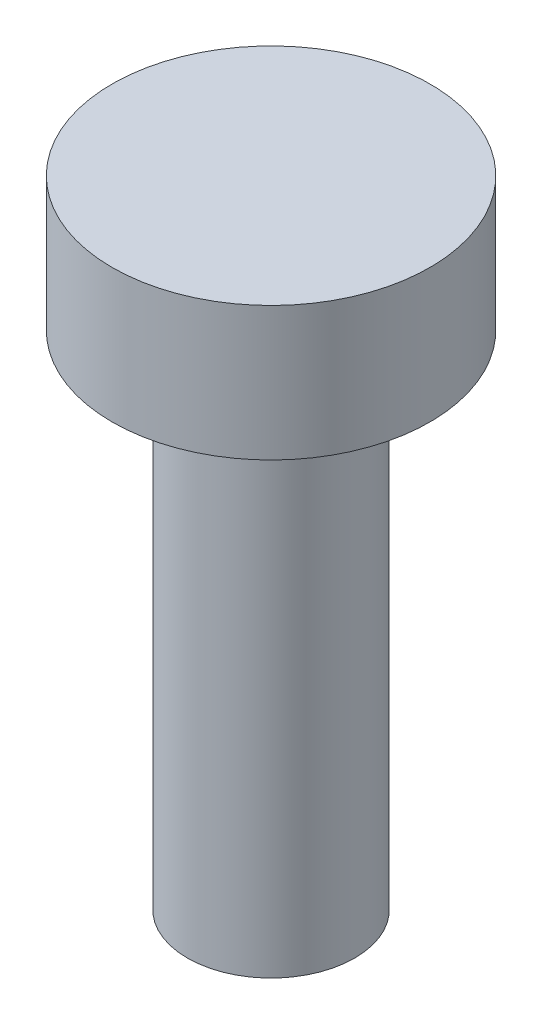
ISO-10303-21;
HEADER;
FILE_DESCRIPTION(('STEP AP214'),'2;1');
FILE_NAME('part.step','',(''),(''),'','','');
FILE_SCHEMA(('AUTOMOTIVE_DESIGN { 1 0 10303 214 1 1 1 1 }'));
ENDSEC;
DATA;
#1=APPLICATION_CONTEXT('core data for automotive mechanical design processes');
#2=APPLICATION_PROTOCOL_DEFINITION('international standard','automotive_design',2000,#1);
#3=PRODUCT_CONTEXT('',#1,'mechanical');
#4=PRODUCT('Part','Part','',(#3));
#5=PRODUCT_RELATED_PRODUCT_CATEGORY('part','',(#4));
#6=PRODUCT_DEFINITION_FORMATION('','',#4);
#7=PRODUCT_DEFINITION_CONTEXT('part definition',#1,'design');
#8=PRODUCT_DEFINITION('design','',#6,#7);
#9=PRODUCT_DEFINITION_SHAPE('','',#8);
#10=(LENGTH_UNIT() NAMED_UNIT(*) SI_UNIT(.MILLI.,.METRE.));
#11=(NAMED_UNIT(*) PLANE_ANGLE_UNIT() SI_UNIT($,.RADIAN.));
#12=(NAMED_UNIT(*) SI_UNIT($,.STERADIAN.) SOLID_ANGLE_UNIT());
#13=UNCERTAINTY_MEASURE_WITH_UNIT(LENGTH_MEASURE(1.E-05),#10,'distance_accuracy_value','');
#14=(GEOMETRIC_REPRESENTATION_CONTEXT(3) GLOBAL_UNCERTAINTY_ASSIGNED_CONTEXT((#13)) GLOBAL_UNIT_ASSIGNED_CONTEXT((#10,
#11,#12)) REPRESENTATION_CONTEXT('',''));
#15=CARTESIAN_POINT('',(0.,0.,0.));
#16=DIRECTION('',(0.,0.,1.));
#17=DIRECTION('',(1.,0.,0.));
#18=AXIS2_PLACEMENT_3D('',#15,#16,#17);
#19=CARTESIAN_POINT('',(0.,1.6,0.));
#20=DIRECTION('',(0.,-1.,0.));
#21=DIRECTION('',(0.,0.,-1.));
#22=AXIS2_PLACEMENT_3D('',#19,#20,#21);
#23=CYLINDRICAL_SURFACE('',#22,1.9);
#24=CARTESIAN_POINT('',(0.,1.6,0.));
#25=DIRECTION('',(0.,1.,0.));
#26=DIRECTION('',(0.,0.,1.));
#27=AXIS2_PLACEMENT_3D('',#24,#25,#26);
#28=CIRCLE('',#27,1.9);
#29=CARTESIAN_POINT('',(0.,1.6,1.9));
#30=VERTEX_POINT('',#29);
#31=EDGE_CURVE('E10',#30,#30,#28,.T.);
#32=ORIENTED_EDGE('',*,*,#31,.F.);
#33=EDGE_LOOP('',(#32));
#34=FACE_BOUND('',#33,.T.);
#35=CARTESIAN_POINT('',(0.,0.,0.));
#36=DIRECTION('',(0.,1.,0.));
#37=DIRECTION('',(0.,0.,1.));
#38=AXIS2_PLACEMENT_3D('',#35,#36,#37);
#39=CIRCLE('',#38,1.9);
#40=CARTESIAN_POINT('',(0.,0.,1.9));
#41=VERTEX_POINT('',#40);
#42=EDGE_CURVE('E42',#41,#41,#39,.T.);
#43=ORIENTED_EDGE('',*,*,#42,.T.);
#44=EDGE_LOOP('',(#43));
#45=FACE_BOUND('',#44,.T.);
#46=ADVANCED_FACE('F41',(#34,#45),#23,.T.);
#47=CARTESIAN_POINT('',(0.,1.6,0.));
#48=DIRECTION('',(0.,1.,0.));
#49=DIRECTION('',(0.,0.,1.));
#50=AXIS2_PLACEMENT_3D('',#47,#48,#49);
#51=PLANE('',#50);
#52=ORIENTED_EDGE('',*,*,#31,.T.);
#53=EDGE_LOOP('',(#52));
#54=FACE_BOUND('',#53,.T.);
#55=ADVANCED_FACE('F74',(#54),#51,.T.);
#56=CARTESIAN_POINT('',(0.,0.,0.));
#57=DIRECTION('',(0.,1.,0.));
#58=DIRECTION('',(0.,0.,1.));
#59=AXIS2_PLACEMENT_3D('',#56,#57,#58);
#60=PLANE('',#59);
#61=CARTESIAN_POINT('',(0.,0.,0.));
#62=DIRECTION('',(0.,1.,0.));
#63=DIRECTION('',(0.,0.,1.));
#64=AXIS2_PLACEMENT_3D('',#61,#62,#63);
#65=CIRCLE('',#64,1.);
#66=CARTESIAN_POINT('',(0.,0.,1.));
#67=VERTEX_POINT('',#66);
#68=EDGE_CURVE('E51',#67,#67,#65,.T.);
#69=ORIENTED_EDGE('',*,*,#68,.T.);
#70=EDGE_LOOP('',(#69));
#71=FACE_BOUND('',#70,.T.);
#72=ORIENTED_EDGE('',*,*,#42,.F.);
#73=EDGE_LOOP('',(#72));
#74=FACE_BOUND('',#73,.T.);
#75=ADVANCED_FACE('F56',(#71,#74),#60,.F.);
#76=CARTESIAN_POINT('',(0.,0.,0.));
#77=DIRECTION('',(0.,-1.,0.));
#78=DIRECTION('',(0.,0.,-1.));
#79=AXIS2_PLACEMENT_3D('',#76,#77,#78);
#80=CYLINDRICAL_SURFACE('',#79,1.);
#81=ORIENTED_EDGE('',*,*,#68,.F.);
#82=EDGE_LOOP('',(#81));
#83=FACE_BOUND('',#82,.T.);
#84=CARTESIAN_POINT('',(0.,-6.,0.));
#85=DIRECTION('',(0.,1.,0.));
#86=DIRECTION('',(0.,0.,1.));
#87=AXIS2_PLACEMENT_3D('',#84,#85,#86);
#88=CIRCLE('',#87,1.);
#89=CARTESIAN_POINT('',(0.,-6.,1.));
#90=VERTEX_POINT('',#89);
#91=EDGE_CURVE('E52',#90,#90,#88,.T.);
#92=ORIENTED_EDGE('',*,*,#91,.T.);
#93=EDGE_LOOP('',(#92));
#94=FACE_BOUND('',#93,.T.);
#95=ADVANCED_FACE('F61',(#83,#94),#80,.T.);
#96=CARTESIAN_POINT('',(0.,-6.,0.));
#97=DIRECTION('',(0.,1.,0.));
#98=DIRECTION('',(0.,0.,1.));
#99=AXIS2_PLACEMENT_3D('',#96,#97,#98);
#100=PLANE('',#99);
#101=ORIENTED_EDGE('',*,*,#91,.F.);
#102=EDGE_LOOP('',(#101));
#103=FACE_BOUND('',#102,.T.);
#104=ADVANCED_FACE('F62',(#103),#100,.F.);
#105=CLOSED_SHELL('',(#46,#55,#75,#95,#104));
#106=MANIFOLD_SOLID_BREP('B2',#105);
#107=ADVANCED_BREP_SHAPE_REPRESENTATION('',(#18,#106),#14);
#108=SHAPE_DEFINITION_REPRESENTATION(#9,#107);
ENDSEC;
END-ISO-10303-21;
